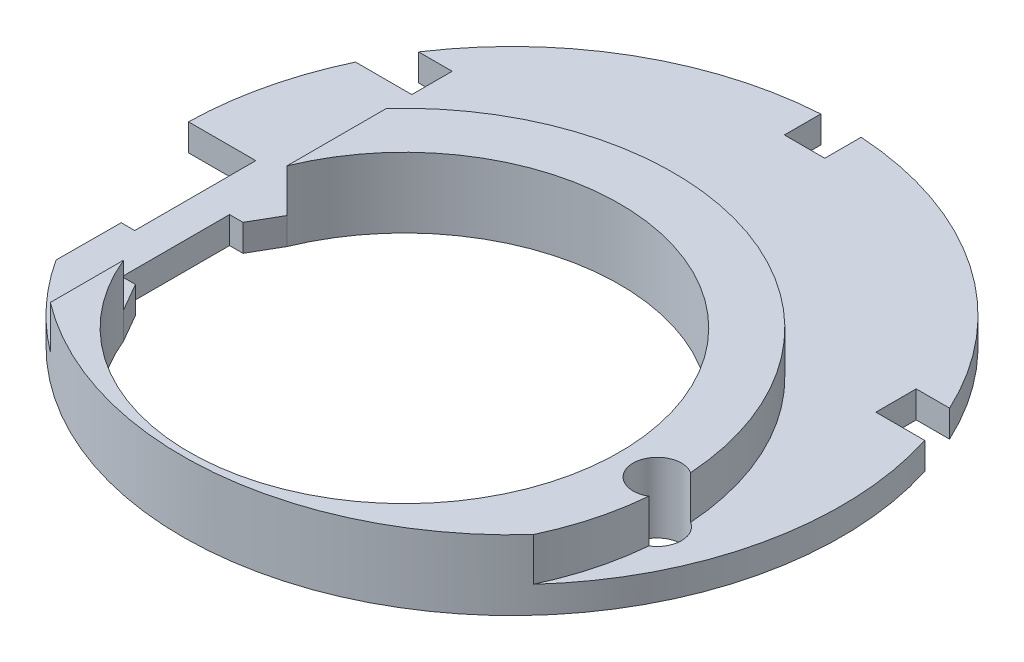
ISO-10303-21;
HEADER;
FILE_DESCRIPTION(('STEP AP214'),'2;1');
FILE_NAME('part.step','',(''),(''),'','','');
FILE_SCHEMA(('AUTOMOTIVE_DESIGN { 1 0 10303 214 1 1 1 1 }'));
ENDSEC;
DATA;
#1=APPLICATION_CONTEXT('core data for automotive mechanical design processes');
#2=APPLICATION_PROTOCOL_DEFINITION('international standard','automotive_design',2000,#1);
#3=PRODUCT_CONTEXT('',#1,'mechanical');
#4=PRODUCT('Part','Part','',(#3));
#5=PRODUCT_RELATED_PRODUCT_CATEGORY('part','',(#4));
#6=PRODUCT_DEFINITION_FORMATION('','',#4);
#7=PRODUCT_DEFINITION_CONTEXT('part definition',#1,'design');
#8=PRODUCT_DEFINITION('design','',#6,#7);
#9=PRODUCT_DEFINITION_SHAPE('','',#8);
#10=(LENGTH_UNIT() NAMED_UNIT(*) SI_UNIT(.MILLI.,.METRE.));
#11=(NAMED_UNIT(*) PLANE_ANGLE_UNIT() SI_UNIT($,.RADIAN.));
#12=(NAMED_UNIT(*) SI_UNIT($,.STERADIAN.) SOLID_ANGLE_UNIT());
#13=UNCERTAINTY_MEASURE_WITH_UNIT(LENGTH_MEASURE(1.E-05),#10,'distance_accuracy_value','');
#14=(GEOMETRIC_REPRESENTATION_CONTEXT(3) GLOBAL_UNCERTAINTY_ASSIGNED_CONTEXT((#13)) GLOBAL_UNIT_ASSIGNED_CONTEXT((#10,
#11,#12)) REPRESENTATION_CONTEXT('',''));
#15=CARTESIAN_POINT('',(0.,0.,0.));
#16=DIRECTION('',(0.,0.,1.));
#17=DIRECTION('',(1.,0.,0.));
#18=AXIS2_PLACEMENT_3D('',#15,#16,#17);
#19=CARTESIAN_POINT('',(0.,2.6,4.));
#20=DIRECTION('',(0.,-1.,0.));
#21=DIRECTION('',(0.,0.,-1.));
#22=AXIS2_PLACEMENT_3D('',#19,#20,#21);
#23=CYLINDRICAL_SURFACE('',#22,10.);
#24=CARTESIAN_POINT('',(0.,1.,4.));
#25=DIRECTION('',(0.,1.,0.));
#26=DIRECTION('',(0.,0.,1.));
#27=AXIS2_PLACEMENT_3D('',#24,#25,#26);
#28=CIRCLE('',#27,10.);
#29=CARTESIAN_POINT('',(9.04826130893907,1.,8.2578125));
#30=VERTEX_POINT('',#29);
#31=CARTESIAN_POINT('',(9.96186896058168,1.,4.87244874474053));
#32=VERTEX_POINT('',#31);
#33=EDGE_CURVE('E314',#30,#32,#28,.T.);
#34=ORIENTED_EDGE('',*,*,#33,.T.);
#35=DIRECTION('',(0.,1.,0.));
#36=VECTOR('',#35,1.);
#37=CARTESIAN_POINT('',(9.96186896058167,1.3,4.87244874474052));
#38=LINE('',#37,#36);
#39=CARTESIAN_POINT('',(9.96186896058167,2.6,4.87244874474052));
#40=VERTEX_POINT('',#39);
#41=EDGE_CURVE('E302',#32,#40,#38,.T.);
#42=ORIENTED_EDGE('',*,*,#41,.T.);
#43=CARTESIAN_POINT('',(0.,2.6,4.));
#44=DIRECTION('',(0.,1.,0.));
#45=DIRECTION('',(0.,0.,1.));
#46=AXIS2_PLACEMENT_3D('',#43,#44,#45);
#47=CIRCLE('',#46,10.);
#48=CARTESIAN_POINT('',(9.04826130893907,2.6,8.2578125));
#49=VERTEX_POINT('',#48);
#50=EDGE_CURVE('E312',#49,#40,#47,.T.);
#51=ORIENTED_EDGE('',*,*,#50,.F.);
#52=DIRECTION('',(0.,-1.,0.));
#53=VECTOR('',#52,1.);
#54=CARTESIAN_POINT('',(9.04826130893907,2.6,8.2578125));
#55=LINE('',#54,#53);
#56=EDGE_CURVE('E354',#49,#30,#55,.T.);
#57=ORIENTED_EDGE('',*,*,#56,.T.);
#58=EDGE_LOOP('',(#34,#42,#51,#57));
#59=FACE_BOUND('',#58,.T.);
#60=ADVANCED_FACE('F35',(#59),#23,.T.);
#61=CARTESIAN_POINT('',(0.,1.,-5.15));
#62=DIRECTION('',(0.,0.,1.));
#63=DIRECTION('',(1.,0.,0.));
#64=AXIS2_PLACEMENT_3D('',#61,#62,#63);
#65=PLANE('',#64);
#66=DIRECTION('',(-1.,0.,0.));
#67=VECTOR('',#66,1.);
#68=CARTESIAN_POINT('',(0.,0.,-5.15));
#69=LINE('',#68,#67);
#70=CARTESIAN_POINT('',(11.1148549248292,0.,-5.15));
#71=VERTEX_POINT('',#70);
#72=CARTESIAN_POINT('',(9.875,0.,-5.15));
#73=VERTEX_POINT('',#72);
#74=EDGE_CURVE('E356',#71,#73,#69,.T.);
#75=ORIENTED_EDGE('',*,*,#74,.F.);
#76=DIRECTION('',(0.,-1.,0.));
#77=VECTOR('',#76,1.);
#78=CARTESIAN_POINT('',(11.1148549248292,1.,-5.15));
#79=LINE('',#78,#77);
#80=CARTESIAN_POINT('',(11.1148549248292,1.,-5.15));
#81=VERTEX_POINT('',#80);
#82=EDGE_CURVE('E297',#81,#71,#79,.T.);
#83=ORIENTED_EDGE('',*,*,#82,.F.);
#84=DIRECTION('',(-1.,0.,0.));
#85=VECTOR('',#84,1.);
#86=CARTESIAN_POINT('',(0.,1.,-5.15));
#87=LINE('',#86,#85);
#88=CARTESIAN_POINT('',(9.875,1.,-5.15));
#89=VERTEX_POINT('',#88);
#90=EDGE_CURVE('E267',#81,#89,#87,.T.);
#91=ORIENTED_EDGE('',*,*,#90,.T.);
#92=DIRECTION('',(0.,-1.,0.));
#93=VECTOR('',#92,1.);
#94=CARTESIAN_POINT('',(9.875,1.,-5.15));
#95=LINE('',#94,#93);
#96=EDGE_CURVE('E268',#89,#73,#95,.T.);
#97=ORIENTED_EDGE('',*,*,#96,.T.);
#98=EDGE_LOOP('',(#75,#83,#91,#97));
#99=FACE_BOUND('',#98,.T.);
#100=ADVANCED_FACE('F37',(#99),#65,.T.);
#101=CARTESIAN_POINT('',(0.,1.,0.));
#102=DIRECTION('',(0.,-1.,0.));
#103=DIRECTION('',(0.,0.,-1.));
#104=AXIS2_PLACEMENT_3D('',#101,#102,#103);
#105=CYLINDRICAL_SURFACE('',#104,12.25);
#106=CARTESIAN_POINT('',(0.,0.,0.));
#107=DIRECTION('',(0.,1.,0.));
#108=DIRECTION('',(0.,0.,1.));
#109=AXIS2_PLACEMENT_3D('',#106,#107,#108);
#110=CIRCLE('',#109,12.25);
#111=CARTESIAN_POINT('',(0.750000000000014,0.,-12.2270192606375));
#112=VERTEX_POINT('',#111);
#113=EDGE_CURVE('E394',#71,#112,#110,.T.);
#114=ORIENTED_EDGE('',*,*,#113,.T.);
#115=DIRECTION('',(0.,-1.,0.));
#116=VECTOR('',#115,1.);
#117=CARTESIAN_POINT('',(0.750000000000014,1.,-12.2270192606375));
#118=LINE('',#117,#116);
#119=CARTESIAN_POINT('',(0.750000000000014,1.,-12.2270192606375));
#120=VERTEX_POINT('',#119);
#121=EDGE_CURVE('E294',#120,#112,#118,.T.);
#122=ORIENTED_EDGE('',*,*,#121,.F.);
#123=CARTESIAN_POINT('',(0.,1.,0.));
#124=DIRECTION('',(0.,1.,0.));
#125=DIRECTION('',(0.,0.,1.));
#126=AXIS2_PLACEMENT_3D('',#123,#124,#125);
#127=CIRCLE('',#126,12.25);
#128=EDGE_CURVE('E359',#81,#120,#127,.T.);
#129=ORIENTED_EDGE('',*,*,#128,.F.);
#130=ORIENTED_EDGE('',*,*,#82,.T.);
#131=EDGE_LOOP('',(#114,#122,#129,#130));
#132=FACE_BOUND('',#131,.T.);
#133=ADVANCED_FACE('F450',(#132),#105,.T.);
#134=CARTESIAN_POINT('',(0.750000000000014,1.,0.));
#135=DIRECTION('',(1.,0.,0.));
#136=DIRECTION('',(0.,0.,-1.));
#137=AXIS2_PLACEMENT_3D('',#134,#135,#136);
#138=PLANE('',#137);
#139=DIRECTION('',(0.,0.,1.));
#140=VECTOR('',#139,1.);
#141=CARTESIAN_POINT('',(0.750000000000014,0.,0.));
#142=LINE('',#141,#140);
#143=CARTESIAN_POINT('',(0.750000000000014,0.,-10.875));
#144=VERTEX_POINT('',#143);
#145=EDGE_CURVE('E396',#112,#144,#142,.T.);
#146=ORIENTED_EDGE('',*,*,#145,.T.);
#147=DIRECTION('',(0.,-1.,0.));
#148=VECTOR('',#147,1.);
#149=CARTESIAN_POINT('',(0.750000000000014,1.,-10.875));
#150=LINE('',#149,#148);
#151=CARTESIAN_POINT('',(0.750000000000014,1.,-10.875));
#152=VERTEX_POINT('',#151);
#153=EDGE_CURVE('E291',#152,#144,#150,.T.);
#154=ORIENTED_EDGE('',*,*,#153,.F.);
#155=DIRECTION('',(0.,0.,1.));
#156=VECTOR('',#155,1.);
#157=CARTESIAN_POINT('',(0.750000000000014,1.,0.));
#158=LINE('',#157,#156);
#159=EDGE_CURVE('E361',#120,#152,#158,.T.);
#160=ORIENTED_EDGE('',*,*,#159,.F.);
#161=ORIENTED_EDGE('',*,*,#121,.T.);
#162=EDGE_LOOP('',(#146,#154,#160,#161));
#163=FACE_BOUND('',#162,.T.);
#164=ADVANCED_FACE('F445',(#163),#138,.F.);
#165=CARTESIAN_POINT('',(0.,1.,-10.875));
#166=DIRECTION('',(0.,0.,1.));
#167=DIRECTION('',(1.,0.,0.));
#168=AXIS2_PLACEMENT_3D('',#165,#166,#167);
#169=PLANE('',#168);
#170=DIRECTION('',(-1.,0.,0.));
#171=VECTOR('',#170,1.);
#172=CARTESIAN_POINT('',(0.,0.,-10.875));
#173=LINE('',#172,#171);
#174=CARTESIAN_POINT('',(-0.75,0.,-10.875));
#175=VERTEX_POINT('',#174);
#176=EDGE_CURVE('E398',#144,#175,#173,.T.);
#177=ORIENTED_EDGE('',*,*,#176,.T.);
#178=DIRECTION('',(0.,-1.,0.));
#179=VECTOR('',#178,1.);
#180=CARTESIAN_POINT('',(-0.75,1.,-10.875));
#181=LINE('',#180,#179);
#182=CARTESIAN_POINT('',(-0.75,1.,-10.875));
#183=VERTEX_POINT('',#182);
#184=EDGE_CURVE('E289',#183,#175,#181,.T.);
#185=ORIENTED_EDGE('',*,*,#184,.F.);
#186=DIRECTION('',(-1.,0.,0.));
#187=VECTOR('',#186,1.);
#188=CARTESIAN_POINT('',(0.,1.,-10.875));
#189=LINE('',#188,#187);
#190=EDGE_CURVE('E363',#152,#183,#189,.T.);
#191=ORIENTED_EDGE('',*,*,#190,.F.);
#192=ORIENTED_EDGE('',*,*,#153,.T.);
#193=EDGE_LOOP('',(#177,#185,#191,#192));
#194=FACE_BOUND('',#193,.T.);
#195=ADVANCED_FACE('F439',(#194),#169,.F.);
#196=CARTESIAN_POINT('',(-0.75,1.,0.));
#197=DIRECTION('',(1.,0.,0.));
#198=DIRECTION('',(0.,0.,-1.));
#199=AXIS2_PLACEMENT_3D('',#196,#197,#198);
#200=PLANE('',#199);
#201=DIRECTION('',(0.,0.,1.));
#202=VECTOR('',#201,1.);
#203=CARTESIAN_POINT('',(-0.75,0.,0.));
#204=LINE('',#203,#202);
#205=CARTESIAN_POINT('',(-0.75,0.,-12.2270192606375));
#206=VERTEX_POINT('',#205);
#207=EDGE_CURVE('E401',#206,#175,#204,.T.);
#208=ORIENTED_EDGE('',*,*,#207,.F.);
#209=DIRECTION('',(0.,-1.,0.));
#210=VECTOR('',#209,1.);
#211=CARTESIAN_POINT('',(-0.75,1.,-12.2270192606375));
#212=LINE('',#211,#210);
#213=CARTESIAN_POINT('',(-0.75,1.,-12.2270192606375));
#214=VERTEX_POINT('',#213);
#215=EDGE_CURVE('E287',#214,#206,#212,.T.);
#216=ORIENTED_EDGE('',*,*,#215,.F.);
#217=DIRECTION('',(0.,0.,1.));
#218=VECTOR('',#217,1.);
#219=CARTESIAN_POINT('',(-0.75,1.,0.));
#220=LINE('',#219,#218);
#221=EDGE_CURVE('E365',#214,#183,#220,.T.);
#222=ORIENTED_EDGE('',*,*,#221,.T.);
#223=ORIENTED_EDGE('',*,*,#184,.T.);
#224=EDGE_LOOP('',(#208,#216,#222,#223));
#225=FACE_BOUND('',#224,.T.);
#226=ADVANCED_FACE('F433',(#225),#200,.T.);
#227=CARTESIAN_POINT('',(0.,1.,0.));
#228=DIRECTION('',(0.,-1.,0.));
#229=DIRECTION('',(0.,0.,-1.));
#230=AXIS2_PLACEMENT_3D('',#227,#228,#229);
#231=CYLINDRICAL_SURFACE('',#230,12.25);
#232=CARTESIAN_POINT('',(0.,0.,0.));
#233=DIRECTION('',(0.,1.,0.));
#234=DIRECTION('',(0.,0.,1.));
#235=AXIS2_PLACEMENT_3D('',#232,#233,#234);
#236=CIRCLE('',#235,12.25);
#237=CARTESIAN_POINT('',(-10.2225241501304,0.,-6.75));
#238=VERTEX_POINT('',#237);
#239=EDGE_CURVE('E404',#206,#238,#236,.T.);
#240=ORIENTED_EDGE('',*,*,#239,.T.);
#241=DIRECTION('',(0.,-1.,0.));
#242=VECTOR('',#241,1.);
#243=CARTESIAN_POINT('',(-10.2225241501304,1.,-6.75));
#244=LINE('',#243,#242);
#245=CARTESIAN_POINT('',(-10.2225241501304,1.,-6.75));
#246=VERTEX_POINT('',#245);
#247=EDGE_CURVE('E285',#246,#238,#244,.T.);
#248=ORIENTED_EDGE('',*,*,#247,.F.);
#249=CARTESIAN_POINT('',(0.,1.,0.));
#250=DIRECTION('',(0.,1.,0.));
#251=DIRECTION('',(0.,0.,1.));
#252=AXIS2_PLACEMENT_3D('',#249,#250,#251);
#253=CIRCLE('',#252,12.25);
#254=EDGE_CURVE('E368',#214,#246,#253,.T.);
#255=ORIENTED_EDGE('',*,*,#254,.F.);
#256=ORIENTED_EDGE('',*,*,#215,.T.);
#257=EDGE_LOOP('',(#240,#248,#255,#256));
#258=FACE_BOUND('',#257,.T.);
#259=ADVANCED_FACE('F530',(#258),#231,.T.);
#260=CARTESIAN_POINT('',(0.,1.,-6.75));
#261=DIRECTION('',(0.,0.,1.));
#262=DIRECTION('',(1.,0.,0.));
#263=AXIS2_PLACEMENT_3D('',#260,#261,#262);
#264=PLANE('',#263);
#265=DIRECTION('',(-1.,0.,0.));
#266=VECTOR('',#265,1.);
#267=CARTESIAN_POINT('',(0.,0.,-6.75));
#268=LINE('',#267,#266);
#269=CARTESIAN_POINT('',(-8.975,0.,-6.75));
#270=VERTEX_POINT('',#269);
#271=EDGE_CURVE('E407',#270,#238,#268,.T.);
#272=ORIENTED_EDGE('',*,*,#271,.F.);
#273=DIRECTION('',(0.,-1.,0.));
#274=VECTOR('',#273,1.);
#275=CARTESIAN_POINT('',(-8.975,1.,-6.75));
#276=LINE('',#275,#274);
#277=CARTESIAN_POINT('',(-8.975,1.,-6.75));
#278=VERTEX_POINT('',#277);
#279=EDGE_CURVE('E283',#278,#270,#276,.T.);
#280=ORIENTED_EDGE('',*,*,#279,.F.);
#281=DIRECTION('',(-1.,0.,0.));
#282=VECTOR('',#281,1.);
#283=CARTESIAN_POINT('',(0.,1.,-6.75));
#284=LINE('',#283,#282);
#285=EDGE_CURVE('E370',#278,#246,#284,.T.);
#286=ORIENTED_EDGE('',*,*,#285,.T.);
#287=ORIENTED_EDGE('',*,*,#247,.T.);
#288=EDGE_LOOP('',(#272,#280,#286,#287));
#289=FACE_BOUND('',#288,.T.);
#290=ADVANCED_FACE('F426',(#289),#264,.T.);
#291=CARTESIAN_POINT('',(-8.975,1.,0.));
#292=DIRECTION('',(-1.,0.,0.));
#293=DIRECTION('',(0.,0.,1.));
#294=AXIS2_PLACEMENT_3D('',#291,#292,#293);
#295=PLANE('',#294);
#296=DIRECTION('',(0.,0.,-1.));
#297=VECTOR('',#296,1.);
#298=CARTESIAN_POINT('',(-8.975,0.,0.));
#299=LINE('',#298,#297);
#300=CARTESIAN_POINT('',(-8.975,0.,-5.25));
#301=VERTEX_POINT('',#300);
#302=EDGE_CURVE('E410',#301,#270,#299,.T.);
#303=ORIENTED_EDGE('',*,*,#302,.F.);
#304=DIRECTION('',(0.,-1.,0.));
#305=VECTOR('',#304,1.);
#306=CARTESIAN_POINT('',(-8.975,1.,-5.25));
#307=LINE('',#306,#305);
#308=CARTESIAN_POINT('',(-8.975,1.,-5.25));
#309=VERTEX_POINT('',#308);
#310=EDGE_CURVE('E281',#309,#301,#307,.T.);
#311=ORIENTED_EDGE('',*,*,#310,.F.);
#312=DIRECTION('',(0.,0.,-1.));
#313=VECTOR('',#312,1.);
#314=CARTESIAN_POINT('',(-8.975,1.,0.));
#315=LINE('',#314,#313);
#316=EDGE_CURVE('E373',#309,#278,#315,.T.);
#317=ORIENTED_EDGE('',*,*,#316,.T.);
#318=ORIENTED_EDGE('',*,*,#279,.T.);
#319=EDGE_LOOP('',(#303,#311,#317,#318));
#320=FACE_BOUND('',#319,.T.);
#321=ADVANCED_FACE('F422',(#320),#295,.T.);
#322=CARTESIAN_POINT('',(0.,1.,-5.25));
#323=DIRECTION('',(0.,0.,-1.));
#324=DIRECTION('',(-1.,0.,0.));
#325=AXIS2_PLACEMENT_3D('',#322,#323,#324);
#326=PLANE('',#325);
#327=DIRECTION('',(1.,0.,0.));
#328=VECTOR('',#327,1.);
#329=CARTESIAN_POINT('',(0.,0.,-5.25));
#330=LINE('',#329,#328);
#331=CARTESIAN_POINT('',(-11.0679718105893,0.,-5.25));
#332=VERTEX_POINT('',#331);
#333=EDGE_CURVE('E259',#332,#301,#330,.T.);
#334=ORIENTED_EDGE('',*,*,#333,.F.);
#335=DIRECTION('',(0.,-1.,0.));
#336=VECTOR('',#335,1.);
#337=CARTESIAN_POINT('',(-11.0679718105893,1.,-5.25));
#338=LINE('',#337,#336);
#339=CARTESIAN_POINT('',(-11.0679718105893,1.,-5.25));
#340=VERTEX_POINT('',#339);
#341=EDGE_CURVE('E279',#340,#332,#338,.T.);
#342=ORIENTED_EDGE('',*,*,#341,.F.);
#343=DIRECTION('',(1.,0.,0.));
#344=VECTOR('',#343,1.);
#345=CARTESIAN_POINT('',(0.,1.,-5.25));
#346=LINE('',#345,#344);
#347=EDGE_CURVE('E376',#340,#309,#346,.T.);
#348=ORIENTED_EDGE('',*,*,#347,.T.);
#349=ORIENTED_EDGE('',*,*,#310,.T.);
#350=EDGE_LOOP('',(#334,#342,#348,#349));
#351=FACE_BOUND('',#350,.T.);
#352=ADVANCED_FACE('F417',(#351),#326,.T.);
#353=CARTESIAN_POINT('',(0.,1.,0.));
#354=DIRECTION('',(0.,-1.,0.));
#355=DIRECTION('',(0.,0.,-1.));
#356=AXIS2_PLACEMENT_3D('',#353,#354,#355);
#357=CYLINDRICAL_SURFACE('',#356,12.25);
#358=CARTESIAN_POINT('',(0.,0.,0.));
#359=DIRECTION('',(0.,1.,0.));
#360=DIRECTION('',(0.,0.,1.));
#361=AXIS2_PLACEMENT_3D('',#358,#359,#360);
#362=CIRCLE('',#361,12.25);
#363=CARTESIAN_POINT('',(-12.2479733622194,0.,-0.222819474831643));
#364=VERTEX_POINT('',#363);
#365=EDGE_CURVE('E254',#332,#364,#362,.T.);
#366=ORIENTED_EDGE('',*,*,#365,.T.);
#367=DIRECTION('',(0.,1.,0.));
#368=VECTOR('',#367,1.);
#369=CARTESIAN_POINT('',(-12.2479733622194,0.,-0.222819474831643));
#370=LINE('',#369,#368);
#371=CARTESIAN_POINT('',(-12.2479733622194,1.,-0.222819474831643));
#372=VERTEX_POINT('',#371);
#373=EDGE_CURVE('E491',#364,#372,#370,.T.);
#374=ORIENTED_EDGE('',*,*,#373,.T.);
#375=CARTESIAN_POINT('',(0.,1.,0.));
#376=DIRECTION('',(0.,1.,0.));
#377=DIRECTION('',(0.,0.,1.));
#378=AXIS2_PLACEMENT_3D('',#375,#376,#377);
#379=CIRCLE('',#378,12.25);
#380=EDGE_CURVE('E379',#340,#372,#379,.T.);
#381=ORIENTED_EDGE('',*,*,#380,.F.);
#382=ORIENTED_EDGE('',*,*,#341,.T.);
#383=EDGE_LOOP('',(#366,#374,#381,#382));
#384=FACE_BOUND('',#383,.T.);
#385=ADVANCED_FACE('F529',(#384),#357,.T.);
#386=CARTESIAN_POINT('',(-10.2326073884271,1.,-0.0446238835659257));
#387=DIRECTION('',(0.999990491195574,0.,0.00436090798290692));
#388=DIRECTION('',(0.00436090798290692,0.,-0.999990491195574));
#389=AXIS2_PLACEMENT_3D('',#386,#387,#388);
#390=PLANE('',#389);
#391=DIRECTION('',(-0.00436090798290692,0.,0.999990491195574));
#392=VECTOR('',#391,1.);
#393=CARTESIAN_POINT('',(-10.2326073884271,0.,-0.0446238835659257));
#394=LINE('',#393,#392);
#395=CARTESIAN_POINT('',(-10.2514545589878,0.,4.27718052516836));
#396=VERTEX_POINT('',#395);
#397=CARTESIAN_POINT('',(-10.2619761707598,0.,6.68986883808334));
#398=VERTEX_POINT('',#397);
#399=EDGE_CURVE('E247',#396,#398,#394,.T.);
#400=ORIENTED_EDGE('',*,*,#399,.T.);
#401=DIRECTION('',(0.,-1.,0.));
#402=VECTOR('',#401,1.);
#403=CARTESIAN_POINT('',(-10.2619761707598,1.,6.68986883808334));
#404=LINE('',#403,#402);
#405=CARTESIAN_POINT('',(-10.2619761707598,1.,6.68986883808334));
#406=VERTEX_POINT('',#405);
#407=EDGE_CURVE('E275',#406,#398,#404,.T.);
#408=ORIENTED_EDGE('',*,*,#407,.F.);
#409=DIRECTION('',(-0.00436090798290692,0.,0.999990491195574));
#410=VECTOR('',#409,1.);
#411=CARTESIAN_POINT('',(-10.2326073884271,1.,-0.0446238835659257));
#412=LINE('',#411,#410);
#413=CARTESIAN_POINT('',(-10.2514545589878,1.,4.27718052516836));
#414=VERTEX_POINT('',#413);
#415=EDGE_CURVE('E382',#414,#406,#412,.T.);
#416=ORIENTED_EDGE('',*,*,#415,.F.);
#417=DIRECTION('',(0.,-1.,0.));
#418=VECTOR('',#417,1.);
#419=CARTESIAN_POINT('',(-10.2514545589878,1.,4.27718052516836));
#420=LINE('',#419,#418);
#421=EDGE_CURVE('E277',#414,#396,#420,.T.);
#422=ORIENTED_EDGE('',*,*,#421,.T.);
#423=EDGE_LOOP('',(#400,#408,#416,#422));
#424=FACE_BOUND('',#423,.T.);
#425=ADVANCED_FACE('F467',(#424),#390,.F.);
#426=CARTESIAN_POINT('',(0.,1.,0.));
#427=DIRECTION('',(0.,-1.,0.));
#428=DIRECTION('',(0.,0.,-1.));
#429=AXIS2_PLACEMENT_3D('',#426,#427,#428);
#430=CYLINDRICAL_SURFACE('',#429,12.25);
#431=CARTESIAN_POINT('',(0.,0.,0.));
#432=DIRECTION('',(0.,1.,0.));
#433=DIRECTION('',(0.,0.,1.));
#434=AXIS2_PLACEMENT_3D('',#431,#432,#433);
#435=CIRCLE('',#434,12.25);
#436=CARTESIAN_POINT('',(11.6935879865848,0.,-3.65));
#437=VERTEX_POINT('',#436);
#438=EDGE_CURVE('E250',#398,#437,#435,.T.);
#439=ORIENTED_EDGE('',*,*,#438,.T.);
#440=DIRECTION('',(0.,-1.,0.));
#441=VECTOR('',#440,1.);
#442=CARTESIAN_POINT('',(11.6935879865848,1.,-3.65));
#443=LINE('',#442,#441);
#444=CARTESIAN_POINT('',(11.6935879865848,1.,-3.65));
#445=VERTEX_POINT('',#444);
#446=EDGE_CURVE('E273',#445,#437,#443,.T.);
#447=ORIENTED_EDGE('',*,*,#446,.F.);
#448=CARTESIAN_POINT('',(0.,1.,0.));
#449=DIRECTION('',(0.,1.,0.));
#450=DIRECTION('',(0.,0.,1.));
#451=AXIS2_PLACEMENT_3D('',#448,#449,#450);
#452=CIRCLE('',#451,12.25);
#453=EDGE_CURVE('E384',#30,#445,#452,.T.);
#454=ORIENTED_EDGE('',*,*,#453,.F.);
#455=ORIENTED_EDGE('',*,*,#56,.F.);
#456=CARTESIAN_POINT('',(0.,2.6,0.));
#457=DIRECTION('',(0.,1.,0.));
#458=DIRECTION('',(0.,0.,1.));
#459=AXIS2_PLACEMENT_3D('',#456,#457,#458);
#460=CIRCLE('',#459,12.25);
#461=CARTESIAN_POINT('',(-7.40072006886185,2.6,9.76175406688498));
#462=VERTEX_POINT('',#461);
#463=EDGE_CURVE('E320',#462,#49,#460,.T.);
#464=ORIENTED_EDGE('',*,*,#463,.F.);
#465=DIRECTION('',(0.,-1.,0.));
#466=VECTOR('',#465,1.);
#467=CARTESIAN_POINT('',(-7.40072006886185,2.6,9.76175406688498));
#468=LINE('',#467,#466);
#469=CARTESIAN_POINT('',(-7.40072006886185,1.,9.76175406688498));
#470=VERTEX_POINT('',#469);
#471=EDGE_CURVE('E335',#462,#470,#468,.T.);
#472=ORIENTED_EDGE('',*,*,#471,.T.);
#473=EDGE_CURVE('E385',#406,#470,#452,.T.);
#474=ORIENTED_EDGE('',*,*,#473,.F.);
#475=ORIENTED_EDGE('',*,*,#407,.T.);
#476=EDGE_LOOP('',(#439,#447,#454,#455,#464,#472,#474,#475));
#477=FACE_BOUND('',#476,.T.);
#478=ADVANCED_FACE('F464',(#477),#430,.T.);
#479=CARTESIAN_POINT('',(0.,1.,-3.65));
#480=DIRECTION('',(0.,0.,-1.));
#481=DIRECTION('',(-1.,0.,0.));
#482=AXIS2_PLACEMENT_3D('',#479,#480,#481);
#483=PLANE('',#482);
#484=DIRECTION('',(1.,0.,0.));
#485=VECTOR('',#484,1.);
#486=CARTESIAN_POINT('',(0.,0.,-3.65));
#487=LINE('',#486,#485);
#488=CARTESIAN_POINT('',(9.875,0.,-3.65));
#489=VERTEX_POINT('',#488);
#490=EDGE_CURVE('E256',#489,#437,#487,.T.);
#491=ORIENTED_EDGE('',*,*,#490,.F.);
#492=DIRECTION('',(0.,-1.,0.));
#493=VECTOR('',#492,1.);
#494=CARTESIAN_POINT('',(9.875,1.,-3.65));
#495=LINE('',#494,#493);
#496=CARTESIAN_POINT('',(9.875,1.,-3.65));
#497=VERTEX_POINT('',#496);
#498=EDGE_CURVE('E270',#497,#489,#495,.T.);
#499=ORIENTED_EDGE('',*,*,#498,.F.);
#500=DIRECTION('',(1.,0.,0.));
#501=VECTOR('',#500,1.);
#502=CARTESIAN_POINT('',(0.,1.,-3.65));
#503=LINE('',#502,#501);
#504=EDGE_CURVE('E387',#497,#445,#503,.T.);
#505=ORIENTED_EDGE('',*,*,#504,.T.);
#506=ORIENTED_EDGE('',*,*,#446,.T.);
#507=EDGE_LOOP('',(#491,#499,#505,#506));
#508=FACE_BOUND('',#507,.T.);
#509=ADVANCED_FACE('F460',(#508),#483,.T.);
#510=CARTESIAN_POINT('',(9.875,1.,0.));
#511=DIRECTION('',(1.,0.,0.));
#512=DIRECTION('',(0.,0.,-1.));
#513=AXIS2_PLACEMENT_3D('',#510,#511,#512);
#514=PLANE('',#513);
#515=DIRECTION('',(0.,0.,1.));
#516=VECTOR('',#515,1.);
#517=CARTESIAN_POINT('',(9.875,0.,0.));
#518=LINE('',#517,#516);
#519=EDGE_CURVE('E264',#73,#489,#518,.T.);
#520=ORIENTED_EDGE('',*,*,#519,.F.);
#521=ORIENTED_EDGE('',*,*,#96,.F.);
#522=DIRECTION('',(0.,0.,1.));
#523=VECTOR('',#522,1.);
#524=CARTESIAN_POINT('',(9.875,1.,0.));
#525=LINE('',#524,#523);
#526=EDGE_CURVE('E271',#89,#497,#525,.T.);
#527=ORIENTED_EDGE('',*,*,#526,.T.);
#528=ORIENTED_EDGE('',*,*,#498,.T.);
#529=EDGE_LOOP('',(#520,#521,#527,#528));
#530=FACE_BOUND('',#529,.T.);
#531=ADVANCED_FACE('F456',(#530),#514,.T.);
#532=CARTESIAN_POINT('',(0.,1.,0.));
#533=DIRECTION('',(0.,1.,0.));
#534=DIRECTION('',(0.,0.,1.));
#535=AXIS2_PLACEMENT_3D('',#532,#533,#534);
#536=PLANE('',#535);
#537=DIRECTION('',(1.,0.,0.));
#538=VECTOR('',#537,1.);
#539=CARTESIAN_POINT('',(0.,1.,4.27718052516836));
#540=LINE('',#539,#538);
#541=CARTESIAN_POINT('',(-9.74797336221939,1.,4.27718052516836));
#542=VERTEX_POINT('',#541);
#543=EDGE_CURVE('E232',#414,#542,#540,.T.);
#544=ORIENTED_EDGE('',*,*,#543,.F.);
#545=ORIENTED_EDGE('',*,*,#415,.T.);
#546=ORIENTED_EDGE('',*,*,#473,.T.);
#547=DIRECTION('',(0.,0.,1.));
#548=VECTOR('',#547,1.);
#549=CARTESIAN_POINT('',(-7.40072006886185,1.,0.));
#550=LINE('',#549,#548);
#551=CARTESIAN_POINT('',(-7.40072006886185,1.,7.03798328868766));
#552=VERTEX_POINT('',#551);
#553=EDGE_CURVE('E341',#552,#470,#550,.T.);
#554=ORIENTED_EDGE('',*,*,#553,.F.);
#555=DIRECTION('',(0.5,0.,0.866025403784439));
#556=VECTOR('',#555,1.);
#557=CARTESIAN_POINT('',(-8.59807621135332,1.,4.96410161513776));
#558=LINE('',#557,#556);
#559=CARTESIAN_POINT('',(-8.,1.,6.));
#560=VERTEX_POINT('',#559);
#561=EDGE_CURVE('E315',#560,#552,#558,.T.);
#562=ORIENTED_EDGE('',*,*,#561,.F.);
#563=DIRECTION('',(-1.,0.,0.));
#564=VECTOR('',#563,1.);
#565=CARTESIAN_POINT('',(0.,1.,6.));
#566=LINE('',#565,#564);
#567=CARTESIAN_POINT('',(-8.5,1.,6.));
#568=VERTEX_POINT('',#567);
#569=EDGE_CURVE('E477',#560,#568,#566,.T.);
#570=ORIENTED_EDGE('',*,*,#569,.T.);
#571=DIRECTION('',(0.,0.,1.));
#572=VECTOR('',#571,1.);
#573=CARTESIAN_POINT('',(-8.5,1.,0.));
#574=LINE('',#573,#572);
#575=CARTESIAN_POINT('',(-8.5,1.,2.));
#576=VERTEX_POINT('',#575);
#577=EDGE_CURVE('E480',#576,#568,#574,.T.);
#578=ORIENTED_EDGE('',*,*,#577,.F.);
#579=DIRECTION('',(-1.,0.,0.));
#580=VECTOR('',#579,1.);
#581=CARTESIAN_POINT('',(0.,1.,2.));
#582=LINE('',#581,#580);
#583=CARTESIAN_POINT('',(-8.,1.,2.));
#584=VERTEX_POINT('',#583);
#585=EDGE_CURVE('E482',#584,#576,#582,.T.);
#586=ORIENTED_EDGE('',*,*,#585,.F.);
#587=DIRECTION('',(0.499999999999997,0.,-0.86602540378444));
#588=VECTOR('',#587,1.);
#589=CARTESIAN_POINT('',(-5.13397459621559,1.,-2.96410161513775));
#590=LINE('',#589,#588);
#591=CARTESIAN_POINT('',(-7.40072006886183,1.,0.962016711312303));
#592=VERTEX_POINT('',#591);
#593=EDGE_CURVE('E484',#584,#592,#590,.T.);
#594=ORIENTED_EDGE('',*,*,#593,.T.);
#595=DIRECTION('',(0.,0.,-1.));
#596=VECTOR('',#595,1.);
#597=CARTESIAN_POINT('',(-7.40072006886183,1.,0.));
#598=LINE('',#597,#596);
#599=CARTESIAN_POINT('',(-7.40072006886183,1.,-2.72527638557299));
#600=VERTEX_POINT('',#599);
#601=EDGE_CURVE('E337',#592,#600,#598,.T.);
#602=ORIENTED_EDGE('',*,*,#601,.T.);
#603=CARTESIAN_POINT('',(9.97802689583312,1.,3.33744489585332));
#604=VERTEX_POINT('',#603);
#605=EDGE_CURVE('E338',#604,#600,#28,.T.);
#606=ORIENTED_EDGE('',*,*,#605,.F.);
#607=CARTESIAN_POINT('',(9.5,1.,4.1));
#608=DIRECTION('',(0.,1.,0.));
#609=DIRECTION('',(0.,0.,1.));
#610=AXIS2_PLACEMENT_3D('',#607,#608,#609);
#611=CIRCLE('',#610,0.9);
#612=EDGE_CURVE('E316',#32,#604,#611,.T.);
#613=ORIENTED_EDGE('',*,*,#612,.F.);
#614=ORIENTED_EDGE('',*,*,#33,.F.);
#615=ORIENTED_EDGE('',*,*,#453,.T.);
#616=ORIENTED_EDGE('',*,*,#504,.F.);
#617=ORIENTED_EDGE('',*,*,#526,.F.);
#618=ORIENTED_EDGE('',*,*,#90,.F.);
#619=ORIENTED_EDGE('',*,*,#128,.T.);
#620=ORIENTED_EDGE('',*,*,#159,.T.);
#621=ORIENTED_EDGE('',*,*,#190,.T.);
#622=ORIENTED_EDGE('',*,*,#221,.F.);
#623=ORIENTED_EDGE('',*,*,#254,.T.);
#624=ORIENTED_EDGE('',*,*,#285,.F.);
#625=ORIENTED_EDGE('',*,*,#316,.F.);
#626=ORIENTED_EDGE('',*,*,#347,.F.);
#627=ORIENTED_EDGE('',*,*,#380,.T.);
#628=DIRECTION('',(-1.,0.,0.));
#629=VECTOR('',#628,1.);
#630=CARTESIAN_POINT('',(0.,1.,-0.222819474831645));
#631=LINE('',#630,#629);
#632=CARTESIAN_POINT('',(-9.74797336221939,1.,-0.222819474831644));
#633=VERTEX_POINT('',#632);
#634=EDGE_CURVE('E473',#633,#372,#631,.T.);
#635=ORIENTED_EDGE('',*,*,#634,.F.);
#636=DIRECTION('',(0.,0.,-1.));
#637=VECTOR('',#636,1.);
#638=CARTESIAN_POINT('',(-9.74797336221939,1.,0.));
#639=LINE('',#638,#637);
#640=EDGE_CURVE('E472',#542,#633,#639,.T.);
#641=ORIENTED_EDGE('',*,*,#640,.F.);
#642=EDGE_LOOP('',(#544,#545,#546,#554,#562,#570,#578,#586,#594,#602,#606,#613,#614,#615,#616,
#617,#618,#619,#620,#621,#622,#623,#624,#625,#626,#627,#635,#641));
#643=FACE_BOUND('',#642,.T.);
#644=ADVANCED_FACE('F469',(#643),#536,.T.);
#645=CARTESIAN_POINT('',(0.,0.,0.));
#646=DIRECTION('',(0.,1.,0.));
#647=DIRECTION('',(0.,0.,1.));
#648=AXIS2_PLACEMENT_3D('',#645,#646,#647);
#649=PLANE('',#648);
#650=ORIENTED_EDGE('',*,*,#399,.F.);
#651=DIRECTION('',(1.,0.,0.));
#652=VECTOR('',#651,1.);
#653=CARTESIAN_POINT('',(0.,0.,4.27718052516836));
#654=LINE('',#653,#652);
#655=CARTESIAN_POINT('',(-9.74797336221939,0.,4.27718052516836));
#656=VERTEX_POINT('',#655);
#657=EDGE_CURVE('E11',#396,#656,#654,.T.);
#658=ORIENTED_EDGE('',*,*,#657,.T.);
#659=DIRECTION('',(0.,0.,-1.));
#660=VECTOR('',#659,1.);
#661=CARTESIAN_POINT('',(-9.74797336221939,0.,0.));
#662=LINE('',#661,#660);
#663=CARTESIAN_POINT('',(-9.74797336221939,0.,-0.222819474831644));
#664=VERTEX_POINT('',#663);
#665=EDGE_CURVE('E238',#656,#664,#662,.T.);
#666=ORIENTED_EDGE('',*,*,#665,.T.);
#667=DIRECTION('',(-1.,0.,0.));
#668=VECTOR('',#667,1.);
#669=CARTESIAN_POINT('',(0.,0.,-0.222819474831645));
#670=LINE('',#669,#668);
#671=EDGE_CURVE('E50',#664,#364,#670,.T.);
#672=ORIENTED_EDGE('',*,*,#671,.T.);
#673=ORIENTED_EDGE('',*,*,#365,.F.);
#674=ORIENTED_EDGE('',*,*,#333,.T.);
#675=ORIENTED_EDGE('',*,*,#302,.T.);
#676=ORIENTED_EDGE('',*,*,#271,.T.);
#677=ORIENTED_EDGE('',*,*,#239,.F.);
#678=ORIENTED_EDGE('',*,*,#207,.T.);
#679=ORIENTED_EDGE('',*,*,#176,.F.);
#680=ORIENTED_EDGE('',*,*,#145,.F.);
#681=ORIENTED_EDGE('',*,*,#113,.F.);
#682=ORIENTED_EDGE('',*,*,#74,.T.);
#683=ORIENTED_EDGE('',*,*,#519,.T.);
#684=ORIENTED_EDGE('',*,*,#490,.T.);
#685=ORIENTED_EDGE('',*,*,#438,.F.);
#686=EDGE_LOOP('',(#650,#658,#666,#672,#673,#674,#675,#676,#677,#678,#679,#680,#681,#682,#683,
#684,#685));
#687=FACE_BOUND('',#686,.T.);
#688=DIRECTION('',(-1.,0.,0.));
#689=VECTOR('',#688,1.);
#690=CARTESIAN_POINT('',(0.,0.,6.));
#691=LINE('',#690,#689);
#692=CARTESIAN_POINT('',(-8.,0.,6.));
#693=VERTEX_POINT('',#692);
#694=CARTESIAN_POINT('',(-8.5,0.,6.));
#695=VERTEX_POINT('',#694);
#696=EDGE_CURVE('E509',#693,#695,#691,.T.);
#697=ORIENTED_EDGE('',*,*,#696,.F.);
#698=DIRECTION('',(0.5,0.,0.866025403784439));
#699=VECTOR('',#698,1.);
#700=CARTESIAN_POINT('',(-8.59807621135332,0.,4.96410161513776));
#701=LINE('',#700,#699);
#702=CARTESIAN_POINT('',(-7.40072006886185,0.,7.03798328868766));
#703=VERTEX_POINT('',#702);
#704=EDGE_CURVE('E241',#693,#703,#701,.T.);
#705=ORIENTED_EDGE('',*,*,#704,.T.);
#706=CARTESIAN_POINT('',(0.,0.,4.));
#707=DIRECTION('',(0.,1.,0.));
#708=DIRECTION('',(0.,0.,1.));
#709=AXIS2_PLACEMENT_3D('',#706,#707,#708);
#710=CIRCLE('',#709,8.);
#711=CARTESIAN_POINT('',(-7.40072006886183,0.,0.962016711312303));
#712=VERTEX_POINT('',#711);
#713=EDGE_CURVE('E498',#703,#712,#710,.T.);
#714=ORIENTED_EDGE('',*,*,#713,.T.);
#715=DIRECTION('',(0.499999999999997,0.,-0.86602540378444));
#716=VECTOR('',#715,1.);
#717=CARTESIAN_POINT('',(-5.13397459621559,0.,-2.96410161513775));
#718=LINE('',#717,#716);
#719=CARTESIAN_POINT('',(-8.,0.,2.));
#720=VERTEX_POINT('',#719);
#721=EDGE_CURVE('E501',#720,#712,#718,.T.);
#722=ORIENTED_EDGE('',*,*,#721,.F.);
#723=DIRECTION('',(-1.,0.,0.));
#724=VECTOR('',#723,1.);
#725=CARTESIAN_POINT('',(0.,0.,2.));
#726=LINE('',#725,#724);
#727=CARTESIAN_POINT('',(-8.5,0.,2.));
#728=VERTEX_POINT('',#727);
#729=EDGE_CURVE('E503',#720,#728,#726,.T.);
#730=ORIENTED_EDGE('',*,*,#729,.T.);
#731=DIRECTION('',(0.,0.,1.));
#732=VECTOR('',#731,1.);
#733=CARTESIAN_POINT('',(-8.5,0.,0.));
#734=LINE('',#733,#732);
#735=EDGE_CURVE('E506',#728,#695,#734,.T.);
#736=ORIENTED_EDGE('',*,*,#735,.T.);
#737=EDGE_LOOP('',(#697,#705,#714,#722,#730,#736));
#738=FACE_BOUND('',#737,.T.);
#739=CARTESIAN_POINT('',(9.5,0.,4.1));
#740=DIRECTION('',(0.,1.,0.));
#741=DIRECTION('',(0.,0.,1.));
#742=AXIS2_PLACEMENT_3D('',#739,#740,#741);
#743=CIRCLE('',#742,0.9);
#744=CARTESIAN_POINT('',(9.5,0.,5.));
#745=VERTEX_POINT('',#744);
#746=EDGE_CURVE('E492',#745,#745,#743,.T.);
#747=ORIENTED_EDGE('',*,*,#746,.T.);
#748=EDGE_LOOP('',(#747));
#749=FACE_BOUND('',#748,.T.);
#750=ADVANCED_FACE('F244',(#687,#738,#749),#649,.F.);
#751=CARTESIAN_POINT('',(9.97802689583312,2.6,3.33744489585331));
#752=VERTEX_POINT('',#751);
#753=CARTESIAN_POINT('',(-7.40072006886183,2.6,-2.72527638557299));
#754=VERTEX_POINT('',#753);
#755=EDGE_CURVE('E323',#752,#754,#47,.T.);
#756=ORIENTED_EDGE('',*,*,#755,.F.);
#757=DIRECTION('',(0.,1.,0.));
#758=VECTOR('',#757,1.);
#759=CARTESIAN_POINT('',(9.97802689583312,1.3,3.33744489585332));
#760=LINE('',#759,#758);
#761=EDGE_CURVE('E305',#752,#604,#760,.F.);
#762=ORIENTED_EDGE('',*,*,#761,.T.);
#763=ORIENTED_EDGE('',*,*,#605,.T.);
#764=DIRECTION('',(0.,-1.,0.));
#765=VECTOR('',#764,1.);
#766=CARTESIAN_POINT('',(-7.40072006886183,2.6,-2.72527638557299));
#767=LINE('',#766,#765);
#768=EDGE_CURVE('E351',#754,#600,#767,.T.);
#769=ORIENTED_EDGE('',*,*,#768,.F.);
#770=EDGE_LOOP('',(#756,#762,#763,#769));
#771=FACE_BOUND('',#770,.T.);
#772=ADVANCED_FACE('F541',(#771),#23,.T.);
#773=CARTESIAN_POINT('',(-7.40072006886183,2.6,0.));
#774=DIRECTION('',(-1.,0.,0.));
#775=DIRECTION('',(0.,0.,1.));
#776=AXIS2_PLACEMENT_3D('',#773,#774,#775);
#777=PLANE('',#776);
#778=ORIENTED_EDGE('',*,*,#601,.F.);
#779=DIRECTION('',(0.,-1.,0.));
#780=VECTOR('',#779,1.);
#781=CARTESIAN_POINT('',(-7.40072006886183,2.6,0.962016711312303));
#782=LINE('',#781,#780);
#783=CARTESIAN_POINT('',(-7.40072006886183,2.6,0.962016711312303));
#784=VERTEX_POINT('',#783);
#785=EDGE_CURVE('E349',#784,#592,#782,.T.);
#786=ORIENTED_EDGE('',*,*,#785,.F.);
#787=DIRECTION('',(0.,0.,-1.));
#788=VECTOR('',#787,1.);
#789=CARTESIAN_POINT('',(-7.40072006886183,2.6,0.));
#790=LINE('',#789,#788);
#791=EDGE_CURVE('E322',#784,#754,#790,.T.);
#792=ORIENTED_EDGE('',*,*,#791,.T.);
#793=ORIENTED_EDGE('',*,*,#768,.T.);
#794=EDGE_LOOP('',(#778,#786,#792,#793));
#795=FACE_BOUND('',#794,.T.);
#796=ADVANCED_FACE('F548',(#795),#777,.T.);
#797=CARTESIAN_POINT('',(0.,2.6,4.));
#798=DIRECTION('',(0.,-1.,0.));
#799=DIRECTION('',(0.,0.,-1.));
#800=AXIS2_PLACEMENT_3D('',#797,#798,#799);
#801=CYLINDRICAL_SURFACE('',#800,8.);
#802=ORIENTED_EDGE('',*,*,#785,.T.);
#803=DIRECTION('',(0.,1.,0.));
#804=VECTOR('',#803,1.);
#805=CARTESIAN_POINT('',(-7.40072006886183,0.,0.962016711312303));
#806=LINE('',#805,#804);
#807=EDGE_CURVE('E58',#712,#592,#806,.T.);
#808=ORIENTED_EDGE('',*,*,#807,.F.);
#809=ORIENTED_EDGE('',*,*,#713,.F.);
#810=DIRECTION('',(0.,1.,0.));
#811=VECTOR('',#810,1.);
#812=CARTESIAN_POINT('',(-7.40072006886185,0.,7.03798328868766));
#813=LINE('',#812,#811);
#814=EDGE_CURVE('E511',#703,#552,#813,.T.);
#815=ORIENTED_EDGE('',*,*,#814,.T.);
#816=DIRECTION('',(0.,-1.,0.));
#817=VECTOR('',#816,1.);
#818=CARTESIAN_POINT('',(-7.40072006886185,2.6,7.03798328868766));
#819=LINE('',#818,#817);
#820=CARTESIAN_POINT('',(-7.40072006886185,2.6,7.03798328868766));
#821=VERTEX_POINT('',#820);
#822=EDGE_CURVE('E346',#821,#552,#819,.T.);
#823=ORIENTED_EDGE('',*,*,#822,.F.);
#824=CARTESIAN_POINT('',(0.,2.6,4.));
#825=DIRECTION('',(0.,1.,0.));
#826=DIRECTION('',(0.,0.,1.));
#827=AXIS2_PLACEMENT_3D('',#824,#825,#826);
#828=CIRCLE('',#827,8.);
#829=EDGE_CURVE('E326',#821,#784,#828,.T.);
#830=ORIENTED_EDGE('',*,*,#829,.T.);
#831=EDGE_LOOP('',(#802,#808,#809,#815,#823,#830));
#832=FACE_BOUND('',#831,.T.);
#833=ADVANCED_FACE('F554',(#832),#801,.F.);
#834=CARTESIAN_POINT('',(-7.40072006886185,2.6,0.));
#835=DIRECTION('',(1.,0.,0.));
#836=DIRECTION('',(0.,0.,-1.));
#837=AXIS2_PLACEMENT_3D('',#834,#835,#836);
#838=PLANE('',#837);
#839=ORIENTED_EDGE('',*,*,#553,.T.);
#840=ORIENTED_EDGE('',*,*,#471,.F.);
#841=DIRECTION('',(0.,0.,1.));
#842=VECTOR('',#841,1.);
#843=CARTESIAN_POINT('',(-7.40072006886185,2.6,0.));
#844=LINE('',#843,#842);
#845=EDGE_CURVE('E333',#821,#462,#844,.T.);
#846=ORIENTED_EDGE('',*,*,#845,.F.);
#847=ORIENTED_EDGE('',*,*,#822,.T.);
#848=EDGE_LOOP('',(#839,#840,#846,#847));
#849=FACE_BOUND('',#848,.T.);
#850=ADVANCED_FACE('F565',(#849),#838,.F.);
#851=CARTESIAN_POINT('',(0.,2.6,0.));
#852=DIRECTION('',(0.,1.,0.));
#853=DIRECTION('',(0.,0.,1.));
#854=AXIS2_PLACEMENT_3D('',#851,#852,#853);
#855=PLANE('',#854);
#856=CARTESIAN_POINT('',(9.5,2.6,4.1));
#857=DIRECTION('',(0.,1.,0.));
#858=DIRECTION('',(0.,0.,1.));
#859=AXIS2_PLACEMENT_3D('',#856,#857,#858);
#860=CIRCLE('',#859,0.9);
#861=EDGE_CURVE('E43',#752,#40,#860,.T.);
#862=ORIENTED_EDGE('',*,*,#861,.F.);
#863=ORIENTED_EDGE('',*,*,#755,.T.);
#864=ORIENTED_EDGE('',*,*,#791,.F.);
#865=ORIENTED_EDGE('',*,*,#829,.F.);
#866=ORIENTED_EDGE('',*,*,#845,.T.);
#867=ORIENTED_EDGE('',*,*,#463,.T.);
#868=ORIENTED_EDGE('',*,*,#50,.T.);
#869=EDGE_LOOP('',(#862,#863,#864,#865,#866,#867,#868));
#870=FACE_BOUND('',#869,.T.);
#871=ADVANCED_FACE('F318',(#870),#855,.T.);
#872=CARTESIAN_POINT('',(9.5,0.,4.1));
#873=DIRECTION('',(0.,1.,0.));
#874=DIRECTION('',(0.,0.,1.));
#875=AXIS2_PLACEMENT_3D('',#872,#873,#874);
#876=CYLINDRICAL_SURFACE('',#875,0.9);
#877=ORIENTED_EDGE('',*,*,#746,.F.);
#878=EDGE_LOOP('',(#877));
#879=FACE_BOUND('',#878,.T.);
#880=ORIENTED_EDGE('',*,*,#612,.T.);
#881=ORIENTED_EDGE('',*,*,#761,.F.);
#882=ORIENTED_EDGE('',*,*,#861,.T.);
#883=ORIENTED_EDGE('',*,*,#41,.F.);
#884=EDGE_LOOP('',(#880,#881,#882,#883));
#885=FACE_BOUND('',#884,.T.);
#886=ADVANCED_FACE('F301',(#879,#885),#876,.F.);
#887=CARTESIAN_POINT('',(-8.59807621135332,0.,4.96410161513776));
#888=DIRECTION('',(-0.866025403784439,0.,0.5));
#889=DIRECTION('',(0.5,0.,0.866025403784439));
#890=AXIS2_PLACEMENT_3D('',#887,#888,#889);
#891=PLANE('',#890);
#892=ORIENTED_EDGE('',*,*,#561,.T.);
#893=ORIENTED_EDGE('',*,*,#814,.F.);
#894=ORIENTED_EDGE('',*,*,#704,.F.);
#895=DIRECTION('',(0.,1.,0.));
#896=VECTOR('',#895,1.);
#897=CARTESIAN_POINT('',(-8.,0.,6.));
#898=LINE('',#897,#896);
#899=EDGE_CURVE('E495',#693,#560,#898,.T.);
#900=ORIENTED_EDGE('',*,*,#899,.T.);
#901=EDGE_LOOP('',(#892,#893,#894,#900));
#902=FACE_BOUND('',#901,.T.);
#903=ADVANCED_FACE('F579',(#902),#891,.F.);
#904=CARTESIAN_POINT('',(0.,0.,6.));
#905=DIRECTION('',(0.,0.,-1.));
#906=DIRECTION('',(-1.,0.,0.));
#907=AXIS2_PLACEMENT_3D('',#904,#905,#906);
#908=PLANE('',#907);
#909=ORIENTED_EDGE('',*,*,#899,.F.);
#910=ORIENTED_EDGE('',*,*,#696,.T.);
#911=DIRECTION('',(0.,1.,0.));
#912=VECTOR('',#911,1.);
#913=CARTESIAN_POINT('',(-8.5,0.,6.));
#914=LINE('',#913,#912);
#915=EDGE_CURVE('E514',#695,#568,#914,.T.);
#916=ORIENTED_EDGE('',*,*,#915,.T.);
#917=ORIENTED_EDGE('',*,*,#569,.F.);
#918=EDGE_LOOP('',(#909,#910,#916,#917));
#919=FACE_BOUND('',#918,.T.);
#920=ADVANCED_FACE('F582',(#919),#908,.T.);
#921=CARTESIAN_POINT('',(-8.5,0.,0.));
#922=DIRECTION('',(-1.,0.,0.));
#923=DIRECTION('',(0.,0.,1.));
#924=AXIS2_PLACEMENT_3D('',#921,#922,#923);
#925=PLANE('',#924);
#926=ORIENTED_EDGE('',*,*,#577,.T.);
#927=ORIENTED_EDGE('',*,*,#915,.F.);
#928=ORIENTED_EDGE('',*,*,#735,.F.);
#929=DIRECTION('',(0.,1.,0.));
#930=VECTOR('',#929,1.);
#931=CARTESIAN_POINT('',(-8.5,0.,2.));
#932=LINE('',#931,#930);
#933=EDGE_CURVE('E517',#728,#576,#932,.T.);
#934=ORIENTED_EDGE('',*,*,#933,.T.);
#935=EDGE_LOOP('',(#926,#927,#928,#934));
#936=FACE_BOUND('',#935,.T.);
#937=ADVANCED_FACE('F585',(#936),#925,.F.);
#938=CARTESIAN_POINT('',(0.,0.,2.));
#939=DIRECTION('',(0.,0.,-1.));
#940=DIRECTION('',(-1.,0.,0.));
#941=AXIS2_PLACEMENT_3D('',#938,#939,#940);
#942=PLANE('',#941);
#943=ORIENTED_EDGE('',*,*,#585,.T.);
#944=ORIENTED_EDGE('',*,*,#933,.F.);
#945=ORIENTED_EDGE('',*,*,#729,.F.);
#946=DIRECTION('',(0.,1.,0.));
#947=VECTOR('',#946,1.);
#948=CARTESIAN_POINT('',(-8.,0.,2.));
#949=LINE('',#948,#947);
#950=EDGE_CURVE('E520',#720,#584,#949,.T.);
#951=ORIENTED_EDGE('',*,*,#950,.T.);
#952=EDGE_LOOP('',(#943,#944,#945,#951));
#953=FACE_BOUND('',#952,.T.);
#954=ADVANCED_FACE('F572',(#953),#942,.F.);
#955=CARTESIAN_POINT('',(-5.13397459621559,0.,-2.96410161513775));
#956=DIRECTION('',(0.86602540378444,0.,0.499999999999997));
#957=DIRECTION('',(0.499999999999997,0.,-0.86602540378444));
#958=AXIS2_PLACEMENT_3D('',#955,#956,#957);
#959=PLANE('',#958);
#960=ORIENTED_EDGE('',*,*,#950,.F.);
#961=ORIENTED_EDGE('',*,*,#721,.T.);
#962=ORIENTED_EDGE('',*,*,#807,.T.);
#963=ORIENTED_EDGE('',*,*,#593,.F.);
#964=EDGE_LOOP('',(#960,#961,#962,#963));
#965=FACE_BOUND('',#964,.T.);
#966=ADVANCED_FACE('F569',(#965),#959,.T.);
#967=CARTESIAN_POINT('',(0.,0.,4.27718052516836));
#968=DIRECTION('',(0.,0.,1.));
#969=DIRECTION('',(1.,0.,0.));
#970=AXIS2_PLACEMENT_3D('',#967,#968,#969);
#971=PLANE('',#970);
#972=ORIENTED_EDGE('',*,*,#543,.T.);
#973=DIRECTION('',(0.,1.,0.));
#974=VECTOR('',#973,1.);
#975=CARTESIAN_POINT('',(-9.74797336221939,0.,4.27718052516836));
#976=LINE('',#975,#974);
#977=EDGE_CURVE('E227',#656,#542,#976,.T.);
#978=ORIENTED_EDGE('',*,*,#977,.F.);
#979=ORIENTED_EDGE('',*,*,#657,.F.);
#980=ORIENTED_EDGE('',*,*,#421,.F.);
#981=EDGE_LOOP('',(#972,#978,#979,#980));
#982=FACE_BOUND('',#981,.T.);
#983=ADVANCED_FACE('F229',(#982),#971,.F.);
#984=CARTESIAN_POINT('',(0.,0.,-0.222819474831645));
#985=DIRECTION('',(0.,0.,-1.));
#986=DIRECTION('',(-1.,0.,0.));
#987=AXIS2_PLACEMENT_3D('',#984,#985,#986);
#988=PLANE('',#987);
#989=ORIENTED_EDGE('',*,*,#634,.T.);
#990=ORIENTED_EDGE('',*,*,#373,.F.);
#991=ORIENTED_EDGE('',*,*,#671,.F.);
#992=DIRECTION('',(0.,1.,0.));
#993=VECTOR('',#992,1.);
#994=CARTESIAN_POINT('',(-9.74797336221939,0.,-0.222819474831644));
#995=LINE('',#994,#993);
#996=EDGE_CURVE('E235',#664,#633,#995,.T.);
#997=ORIENTED_EDGE('',*,*,#996,.T.);
#998=EDGE_LOOP('',(#989,#990,#991,#997));
#999=FACE_BOUND('',#998,.T.);
#1000=ADVANCED_FACE('F657',(#999),#988,.F.);
#1001=CARTESIAN_POINT('',(-9.74797336221939,0.,0.));
#1002=DIRECTION('',(1.,0.,0.));
#1003=DIRECTION('',(0.,0.,-1.));
#1004=AXIS2_PLACEMENT_3D('',#1001,#1002,#1003);
#1005=PLANE('',#1004);
#1006=ORIENTED_EDGE('',*,*,#640,.T.);
#1007=ORIENTED_EDGE('',*,*,#996,.F.);
#1008=ORIENTED_EDGE('',*,*,#665,.F.);
#1009=ORIENTED_EDGE('',*,*,#977,.T.);
#1010=EDGE_LOOP('',(#1006,#1007,#1008,#1009));
#1011=FACE_BOUND('',#1010,.T.);
#1012=ADVANCED_FACE('F239',(#1011),#1005,.F.);
#1013=CLOSED_SHELL('',(#60,#100,#133,#164,#195,#226,#259,#290,#321,#352,#385,#425,#478,#509,
#531,#644,#750,#772,#796,#833,#850,#871,#886,#903,#920,#937,#954,#966,#983,#1000,#1012));
#1014=MANIFOLD_SOLID_BREP('B2',#1013);
#1015=ADVANCED_BREP_SHAPE_REPRESENTATION('',(#18,#1014),#14);
#1016=SHAPE_DEFINITION_REPRESENTATION(#9,#1015);
ENDSEC;
END-ISO-10303-21;
